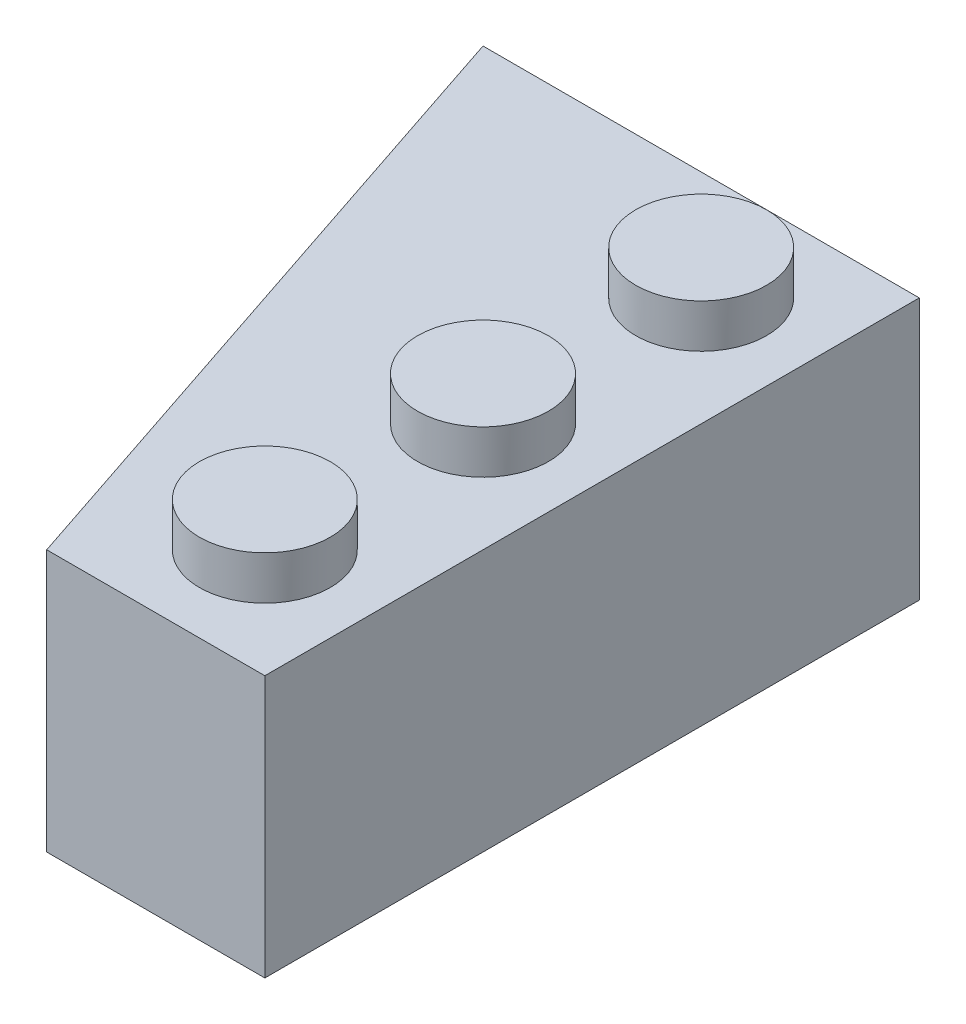
ISO-10303-21;
HEADER;
FILE_DESCRIPTION(('STEP AP214'),'2;1');
FILE_NAME('part.step','',(''),(''),'','','');
FILE_SCHEMA(('AUTOMOTIVE_DESIGN { 1 0 10303 214 1 1 1 1 }'));
ENDSEC;
DATA;
#1=APPLICATION_CONTEXT('core data for automotive mechanical design processes');
#2=APPLICATION_PROTOCOL_DEFINITION('international standard','automotive_design',2000,#1);
#3=PRODUCT_CONTEXT('',#1,'mechanical');
#4=PRODUCT('Part','Part','',(#3));
#5=PRODUCT_RELATED_PRODUCT_CATEGORY('part','',(#4));
#6=PRODUCT_DEFINITION_FORMATION('','',#4);
#7=PRODUCT_DEFINITION_CONTEXT('part definition',#1,'design');
#8=PRODUCT_DEFINITION('design','',#6,#7);
#9=PRODUCT_DEFINITION_SHAPE('','',#8);
#10=(LENGTH_UNIT() NAMED_UNIT(*) SI_UNIT(.MILLI.,.METRE.));
#11=(NAMED_UNIT(*) PLANE_ANGLE_UNIT() SI_UNIT($,.RADIAN.));
#12=(NAMED_UNIT(*) SI_UNIT($,.STERADIAN.) SOLID_ANGLE_UNIT());
#13=UNCERTAINTY_MEASURE_WITH_UNIT(LENGTH_MEASURE(1.E-05),#10,'distance_accuracy_value','');
#14=(GEOMETRIC_REPRESENTATION_CONTEXT(3) GLOBAL_UNCERTAINTY_ASSIGNED_CONTEXT((#13)) GLOBAL_UNIT_ASSIGNED_CONTEXT((#10,
#11,#12)) REPRESENTATION_CONTEXT('',''));
#15=CARTESIAN_POINT('',(0.,0.,0.));
#16=DIRECTION('',(0.,0.,1.));
#17=DIRECTION('',(1.,0.,0.));
#18=AXIS2_PLACEMENT_3D('',#15,#16,#17);
#19=CARTESIAN_POINT('',(0.,0.,0.));
#20=DIRECTION('',(0.,-1.,0.));
#21=DIRECTION('',(0.,0.,-1.));
#22=AXIS2_PLACEMENT_3D('',#19,#20,#21);
#23=PLANE('',#22);
#24=CARTESIAN_POINT('',(-12.,0.,-12.));
#25=DIRECTION('',(0.,-1.,0.));
#26=DIRECTION('',(0.,0.,-1.));
#27=AXIS2_PLACEMENT_3D('',#24,#25,#26);
#28=CIRCLE('',#27,2.4);
#29=CARTESIAN_POINT('',(-9.91642129816994,0.,-10.8089081507792));
#30=VERTEX_POINT('',#29);
#31=CARTESIAN_POINT('',(-11.2410533615596,0.,-9.72316008467877));
#32=VERTEX_POINT('',#31);
#33=EDGE_CURVE('E242',#30,#32,#28,.T.);
#34=ORIENTED_EDGE('',*,*,#33,.F.);
#35=DIRECTION('',(0.316227766016838,0.,0.948683298050514));
#36=VECTOR('',#35,1.);
#37=CARTESIAN_POINT('',(-5.68210672311918,0.,1.89403557437306));
#38=LINE('',#37,#36);
#39=CARTESIAN_POINT('',(-6.8467852479102,0.,-1.6));
#40=VERTEX_POINT('',#39);
#41=EDGE_CURVE('E161',#30,#40,#38,.T.);
#42=ORIENTED_EDGE('',*,*,#41,.T.);
#43=DIRECTION('',(1.,0.,0.));
#44=VECTOR('',#43,1.);
#45=CARTESIAN_POINT('',(0.,0.,-1.6));
#46=LINE('',#45,#44);
#47=CARTESIAN_POINT('',(-1.6,0.,-1.6));
#48=VERTEX_POINT('',#47);
#49=EDGE_CURVE('E163',#40,#48,#46,.T.);
#50=ORIENTED_EDGE('',*,*,#49,.T.);
#51=DIRECTION('',(0.,0.,-1.));
#52=VECTOR('',#51,1.);
#53=CARTESIAN_POINT('',(-1.6,0.,0.));
#54=LINE('',#53,#52);
#55=CARTESIAN_POINT('',(-1.6,0.,-22.4));
#56=VERTEX_POINT('',#55);
#57=EDGE_CURVE('E169',#48,#56,#54,.T.);
#58=ORIENTED_EDGE('',*,*,#57,.T.);
#59=DIRECTION('',(-1.,0.,0.));
#60=VECTOR('',#59,1.);
#61=CARTESIAN_POINT('',(0.,0.,-22.4));
#62=LINE('',#61,#60);
#63=CARTESIAN_POINT('',(-13.7801185812435,0.,-22.4));
#64=VERTEX_POINT('',#63);
#65=EDGE_CURVE('E164',#56,#64,#62,.T.);
#66=ORIENTED_EDGE('',*,*,#65,.T.);
#67=CARTESIAN_POINT('',(-13.5817802762874,0.,-21.8049850851317));
#68=VERTEX_POINT('',#67);
#69=EDGE_CURVE('E155',#64,#68,#38,.T.);
#70=ORIENTED_EDGE('',*,*,#69,.T.);
#71=CARTESIAN_POINT('',(-12.,0.,-20.));
#72=DIRECTION('',(0.,-1.,0.));
#73=DIRECTION('',(0.,0.,-1.));
#74=AXIS2_PLACEMENT_3D('',#71,#72,#73);
#75=CIRCLE('',#74,2.4);
#76=CARTESIAN_POINT('',(-12.1824331699509,0.,-17.6069437661221));
#77=VERTEX_POINT('',#76);
#78=EDGE_CURVE('E140',#77,#68,#75,.T.);
#79=ORIENTED_EDGE('',*,*,#78,.F.);
#80=CARTESIAN_POINT('',(-11.0477921480684,0.,-14.2030207004747));
#81=VERTEX_POINT('',#80);
#82=EDGE_CURVE('E153',#77,#81,#38,.T.);
#83=ORIENTED_EDGE('',*,*,#82,.T.);
#84=CARTESIAN_POINT('',(-12.7589466384404,0.,-14.2768399153212));
#85=VERTEX_POINT('',#84);
#86=EDGE_CURVE('E227',#85,#81,#28,.T.);
#87=ORIENTED_EDGE('',*,*,#86,.F.);
#88=DIRECTION('',(0.316227766016838,0.,0.948683298050514));
#89=VECTOR('',#88,1.);
#90=CARTESIAN_POINT('',(-8.,0.,0.));
#91=LINE('',#90,#89);
#92=CARTESIAN_POINT('',(-16.,0.,-24.));
#93=VERTEX_POINT('',#92);
#94=EDGE_CURVE('E194',#93,#85,#91,.T.);
#95=ORIENTED_EDGE('',*,*,#94,.F.);
#96=DIRECTION('',(-1.,0.,0.));
#97=VECTOR('',#96,1.);
#98=CARTESIAN_POINT('',(-16.,0.,-24.));
#99=LINE('',#98,#97);
#100=CARTESIAN_POINT('',(0.,0.,-24.));
#101=VERTEX_POINT('',#100);
#102=EDGE_CURVE('E191',#101,#93,#99,.T.);
#103=ORIENTED_EDGE('',*,*,#102,.F.);
#104=DIRECTION('',(0.,0.,-1.));
#105=VECTOR('',#104,1.);
#106=CARTESIAN_POINT('',(0.,0.,-24.));
#107=LINE('',#106,#105);
#108=CARTESIAN_POINT('',(0.,0.,0.));
#109=VERTEX_POINT('',#108);
#110=EDGE_CURVE('E177',#109,#101,#107,.T.);
#111=ORIENTED_EDGE('',*,*,#110,.F.);
#112=DIRECTION('',(1.,0.,0.));
#113=VECTOR('',#112,1.);
#114=CARTESIAN_POINT('',(0.,0.,0.));
#115=LINE('',#114,#113);
#116=CARTESIAN_POINT('',(-8.,0.,0.));
#117=VERTEX_POINT('',#116);
#118=EDGE_CURVE('E182',#117,#109,#115,.T.);
#119=ORIENTED_EDGE('',*,*,#118,.F.);
#120=EDGE_CURVE('E193',#32,#117,#91,.T.);
#121=ORIENTED_EDGE('',*,*,#120,.F.);
#122=EDGE_LOOP('',(#34,#42,#50,#58,#66,#70,#79,#83,#87,#95,#103,#111,#119,#121));
#123=FACE_BOUND('',#122,.T.);
#124=ADVANCED_FACE('F38',(#123),#23,.T.);
#125=CARTESIAN_POINT('',(-4.,11.2,-20.));
#126=DIRECTION('',(0.,1.,0.));
#127=DIRECTION('',(0.,0.,1.));
#128=AXIS2_PLACEMENT_3D('',#125,#126,#127);
#129=PLANE('',#128);
#130=CARTESIAN_POINT('',(-4.,11.2,-20.));
#131=DIRECTION('',(0.,1.,0.));
#132=DIRECTION('',(0.,0.,1.));
#133=AXIS2_PLACEMENT_3D('',#130,#131,#132);
#134=CIRCLE('',#133,2.4);
#135=CARTESIAN_POINT('',(-4.,11.2,-17.6));
#136=VERTEX_POINT('',#135);
#137=EDGE_CURVE('E218',#136,#136,#134,.T.);
#138=ORIENTED_EDGE('',*,*,#137,.T.);
#139=EDGE_LOOP('',(#138));
#140=FACE_BOUND('',#139,.T.);
#141=ADVANCED_FACE('F40',(#140),#129,.T.);
#142=CARTESIAN_POINT('',(-4.,11.2,-20.));
#143=DIRECTION('',(0.,-1.,0.));
#144=DIRECTION('',(0.,0.,-1.));
#145=AXIS2_PLACEMENT_3D('',#142,#143,#144);
#146=CYLINDRICAL_SURFACE('',#145,2.4);
#147=ORIENTED_EDGE('',*,*,#137,.F.);
#148=EDGE_LOOP('',(#147));
#149=FACE_BOUND('',#148,.T.);
#150=CARTESIAN_POINT('',(-4.,9.6,-20.));
#151=DIRECTION('',(0.,-1.,0.));
#152=DIRECTION('',(0.,0.,-1.));
#153=AXIS2_PLACEMENT_3D('',#150,#151,#152);
#154=CIRCLE('',#153,2.4);
#155=CARTESIAN_POINT('',(-4.,9.6,-22.4));
#156=VERTEX_POINT('',#155);
#157=EDGE_CURVE('E215',#156,#156,#154,.F.);
#158=ORIENTED_EDGE('',*,*,#157,.T.);
#159=EDGE_LOOP('',(#158));
#160=FACE_BOUND('',#159,.T.);
#161=ADVANCED_FACE('F332',(#149,#160),#146,.T.);
#162=CARTESIAN_POINT('',(0.,9.6,-24.));
#163=DIRECTION('',(-1.,0.,0.));
#164=DIRECTION('',(0.,0.,1.));
#165=AXIS2_PLACEMENT_3D('',#162,#163,#164);
#166=PLANE('',#165);
#167=ORIENTED_EDGE('',*,*,#110,.T.);
#168=DIRECTION('',(0.,-1.,0.));
#169=VECTOR('',#168,1.);
#170=CARTESIAN_POINT('',(0.,9.6,-24.));
#171=LINE('',#170,#169);
#172=CARTESIAN_POINT('',(0.,9.6,-24.));
#173=VERTEX_POINT('',#172);
#174=EDGE_CURVE('E206',#173,#101,#171,.T.);
#175=ORIENTED_EDGE('',*,*,#174,.F.);
#176=DIRECTION('',(0.,0.,-1.));
#177=VECTOR('',#176,1.);
#178=CARTESIAN_POINT('',(0.,9.6,-24.));
#179=LINE('',#178,#177);
#180=CARTESIAN_POINT('',(0.,9.6,0.));
#181=VERTEX_POINT('',#180);
#182=EDGE_CURVE('E178',#181,#173,#179,.T.);
#183=ORIENTED_EDGE('',*,*,#182,.F.);
#184=DIRECTION('',(0.,-1.,0.));
#185=VECTOR('',#184,1.);
#186=CARTESIAN_POINT('',(0.,9.6,0.));
#187=LINE('',#186,#185);
#188=EDGE_CURVE('E188',#181,#109,#187,.T.);
#189=ORIENTED_EDGE('',*,*,#188,.T.);
#190=EDGE_LOOP('',(#167,#175,#183,#189));
#191=FACE_BOUND('',#190,.T.);
#192=ADVANCED_FACE('F317',(#191),#166,.F.);
#193=CARTESIAN_POINT('',(-16.,9.6,-24.));
#194=DIRECTION('',(0.,0.,1.));
#195=DIRECTION('',(1.,0.,0.));
#196=AXIS2_PLACEMENT_3D('',#193,#194,#195);
#197=PLANE('',#196);
#198=ORIENTED_EDGE('',*,*,#102,.T.);
#199=DIRECTION('',(0.,-1.,0.));
#200=VECTOR('',#199,1.);
#201=CARTESIAN_POINT('',(-16.,9.6,-24.));
#202=LINE('',#201,#200);
#203=CARTESIAN_POINT('',(-16.,9.6,-24.));
#204=VERTEX_POINT('',#203);
#205=EDGE_CURVE('E203',#204,#93,#202,.T.);
#206=ORIENTED_EDGE('',*,*,#205,.F.);
#207=DIRECTION('',(-1.,0.,0.));
#208=VECTOR('',#207,1.);
#209=CARTESIAN_POINT('',(-16.,9.6,-24.));
#210=LINE('',#209,#208);
#211=EDGE_CURVE('E181',#173,#204,#210,.T.);
#212=ORIENTED_EDGE('',*,*,#211,.F.);
#213=ORIENTED_EDGE('',*,*,#174,.T.);
#214=EDGE_LOOP('',(#198,#206,#212,#213));
#215=FACE_BOUND('',#214,.T.);
#216=ADVANCED_FACE('F314',(#215),#197,.F.);
#217=CARTESIAN_POINT('',(-8.,9.6,0.));
#218=DIRECTION('',(0.948683298050514,0.,-0.316227766016838));
#219=DIRECTION('',(-0.316227766016838,0.,-0.948683298050514));
#220=AXIS2_PLACEMENT_3D('',#217,#218,#219);
#221=PLANE('',#220);
#222=DIRECTION('',(-0.316227766016838,0.,-0.948683298050514));
#223=VECTOR('',#222,1.);
#224=CARTESIAN_POINT('',(-8.,1.6,0.));
#225=LINE('',#224,#223);
#226=CARTESIAN_POINT('',(-11.2410533615596,1.6,-9.72316008467877));
#227=VERTEX_POINT('',#226);
#228=CARTESIAN_POINT('',(-12.7589466384404,1.6,-14.2768399153212));
#229=VERTEX_POINT('',#228);
#230=EDGE_CURVE('E238',#227,#229,#225,.T.);
#231=ORIENTED_EDGE('',*,*,#230,.F.);
#232=DIRECTION('',(0.,-1.,0.));
#233=VECTOR('',#232,1.);
#234=CARTESIAN_POINT('',(-11.2410533615596,1.6,-9.72316008467877));
#235=LINE('',#234,#233);
#236=EDGE_CURVE('E237',#227,#32,#235,.T.);
#237=ORIENTED_EDGE('',*,*,#236,.T.);
#238=ORIENTED_EDGE('',*,*,#120,.T.);
#239=DIRECTION('',(0.,-1.,0.));
#240=VECTOR('',#239,1.);
#241=CARTESIAN_POINT('',(-8.,9.6,0.));
#242=LINE('',#241,#240);
#243=CARTESIAN_POINT('',(-8.,9.6,0.));
#244=VERTEX_POINT('',#243);
#245=EDGE_CURVE('E200',#244,#117,#242,.T.);
#246=ORIENTED_EDGE('',*,*,#245,.F.);
#247=DIRECTION('',(0.316227766016838,0.,0.948683298050514));
#248=VECTOR('',#247,1.);
#249=CARTESIAN_POINT('',(-8.,9.6,0.));
#250=LINE('',#249,#248);
#251=EDGE_CURVE('E184',#204,#244,#250,.T.);
#252=ORIENTED_EDGE('',*,*,#251,.F.);
#253=ORIENTED_EDGE('',*,*,#205,.T.);
#254=ORIENTED_EDGE('',*,*,#94,.T.);
#255=DIRECTION('',(0.,-1.,0.));
#256=VECTOR('',#255,1.);
#257=CARTESIAN_POINT('',(-12.7589466384404,1.6,-14.2768399153212));
#258=LINE('',#257,#256);
#259=EDGE_CURVE('E240',#85,#229,#258,.F.);
#260=ORIENTED_EDGE('',*,*,#259,.T.);
#261=EDGE_LOOP('',(#231,#237,#238,#246,#252,#253,#254,#260));
#262=FACE_BOUND('',#261,.T.);
#263=ADVANCED_FACE('F307',(#262),#221,.F.);
#264=CARTESIAN_POINT('',(0.,9.6,0.));
#265=DIRECTION('',(0.,0.,-1.));
#266=DIRECTION('',(-1.,0.,0.));
#267=AXIS2_PLACEMENT_3D('',#264,#265,#266);
#268=PLANE('',#267);
#269=ORIENTED_EDGE('',*,*,#118,.T.);
#270=ORIENTED_EDGE('',*,*,#188,.F.);
#271=DIRECTION('',(1.,0.,0.));
#272=VECTOR('',#271,1.);
#273=CARTESIAN_POINT('',(0.,9.6,0.));
#274=LINE('',#273,#272);
#275=EDGE_CURVE('E186',#244,#181,#274,.T.);
#276=ORIENTED_EDGE('',*,*,#275,.F.);
#277=ORIENTED_EDGE('',*,*,#245,.T.);
#278=EDGE_LOOP('',(#269,#270,#276,#277));
#279=FACE_BOUND('',#278,.T.);
#280=ADVANCED_FACE('F321',(#279),#268,.F.);
#281=CARTESIAN_POINT('',(0.,9.6,0.));
#282=DIRECTION('',(0.,-1.,0.));
#283=DIRECTION('',(0.,0.,-1.));
#284=AXIS2_PLACEMENT_3D('',#281,#282,#283);
#285=PLANE('',#284);
#286=CARTESIAN_POINT('',(-4.,9.6,-12.));
#287=DIRECTION('',(0.,-1.,0.));
#288=DIRECTION('',(0.,0.,-1.));
#289=AXIS2_PLACEMENT_3D('',#286,#287,#288);
#290=CIRCLE('',#289,2.4);
#291=CARTESIAN_POINT('',(-4.,9.6,-14.4));
#292=VERTEX_POINT('',#291);
#293=EDGE_CURVE('E212',#292,#292,#290,.F.);
#294=ORIENTED_EDGE('',*,*,#293,.F.);
#295=EDGE_LOOP('',(#294));
#296=FACE_BOUND('',#295,.T.);
#297=CARTESIAN_POINT('',(-4.,9.6,-4.));
#298=DIRECTION('',(0.,-1.,0.));
#299=DIRECTION('',(0.,0.,-1.));
#300=AXIS2_PLACEMENT_3D('',#297,#298,#299);
#301=CIRCLE('',#300,2.4);
#302=CARTESIAN_POINT('',(-4.,9.6,-6.4));
#303=VERTEX_POINT('',#302);
#304=EDGE_CURVE('E209',#303,#303,#301,.F.);
#305=ORIENTED_EDGE('',*,*,#304,.F.);
#306=EDGE_LOOP('',(#305));
#307=FACE_BOUND('',#306,.T.);
#308=ORIENTED_EDGE('',*,*,#182,.T.);
#309=ORIENTED_EDGE('',*,*,#211,.T.);
#310=ORIENTED_EDGE('',*,*,#251,.T.);
#311=ORIENTED_EDGE('',*,*,#275,.T.);
#312=EDGE_LOOP('',(#308,#309,#310,#311));
#313=FACE_BOUND('',#312,.T.);
#314=ORIENTED_EDGE('',*,*,#157,.F.);
#315=EDGE_LOOP('',(#314));
#316=FACE_BOUND('',#315,.T.);
#317=ADVANCED_FACE('F324',(#296,#307,#313,#316),#285,.F.);
#318=CARTESIAN_POINT('',(-4.,11.2,-4.));
#319=DIRECTION('',(0.,-1.,0.));
#320=DIRECTION('',(0.,0.,-1.));
#321=AXIS2_PLACEMENT_3D('',#318,#319,#320);
#322=CYLINDRICAL_SURFACE('',#321,2.4);
#323=CARTESIAN_POINT('',(-4.,11.2,-4.));
#324=DIRECTION('',(0.,1.,0.));
#325=DIRECTION('',(0.,0.,1.));
#326=AXIS2_PLACEMENT_3D('',#323,#324,#325);
#327=CIRCLE('',#326,2.4);
#328=CARTESIAN_POINT('',(-4.,11.2,-1.6));
#329=VERTEX_POINT('',#328);
#330=EDGE_CURVE('E173',#329,#329,#327,.T.);
#331=ORIENTED_EDGE('',*,*,#330,.F.);
#332=EDGE_LOOP('',(#331));
#333=FACE_BOUND('',#332,.T.);
#334=ORIENTED_EDGE('',*,*,#304,.T.);
#335=EDGE_LOOP('',(#334));
#336=FACE_BOUND('',#335,.T.);
#337=ADVANCED_FACE('F327',(#333,#336),#322,.T.);
#338=CARTESIAN_POINT('',(-4.,11.2,-4.));
#339=DIRECTION('',(0.,1.,0.));
#340=DIRECTION('',(0.,0.,1.));
#341=AXIS2_PLACEMENT_3D('',#338,#339,#340);
#342=PLANE('',#341);
#343=ORIENTED_EDGE('',*,*,#330,.T.);
#344=EDGE_LOOP('',(#343));
#345=FACE_BOUND('',#344,.T.);
#346=ADVANCED_FACE('F380',(#345),#342,.T.);
#347=CARTESIAN_POINT('',(-4.,11.2,-12.));
#348=DIRECTION('',(0.,-1.,0.));
#349=DIRECTION('',(0.,0.,-1.));
#350=AXIS2_PLACEMENT_3D('',#347,#348,#349);
#351=CYLINDRICAL_SURFACE('',#350,2.4);
#352=CARTESIAN_POINT('',(-4.,11.2,-12.));
#353=DIRECTION('',(0.,1.,0.));
#354=DIRECTION('',(0.,0.,1.));
#355=AXIS2_PLACEMENT_3D('',#352,#353,#354);
#356=CIRCLE('',#355,2.4);
#357=CARTESIAN_POINT('',(-4.,11.2,-9.6));
#358=VERTEX_POINT('',#357);
#359=EDGE_CURVE('E170',#358,#358,#356,.T.);
#360=ORIENTED_EDGE('',*,*,#359,.F.);
#361=EDGE_LOOP('',(#360));
#362=FACE_BOUND('',#361,.T.);
#363=ORIENTED_EDGE('',*,*,#293,.T.);
#364=EDGE_LOOP('',(#363));
#365=FACE_BOUND('',#364,.T.);
#366=ADVANCED_FACE('F387',(#362,#365),#351,.T.);
#367=CARTESIAN_POINT('',(-4.,11.2,-12.));
#368=DIRECTION('',(0.,1.,0.));
#369=DIRECTION('',(0.,0.,1.));
#370=AXIS2_PLACEMENT_3D('',#367,#368,#369);
#371=PLANE('',#370);
#372=ORIENTED_EDGE('',*,*,#359,.T.);
#373=EDGE_LOOP('',(#372));
#374=FACE_BOUND('',#373,.T.);
#375=ADVANCED_FACE('F395',(#374),#371,.T.);
#376=CARTESIAN_POINT('',(-4.,9.6,-20.));
#377=DIRECTION('',(0.,1.,0.));
#378=DIRECTION('',(0.,0.,1.));
#379=AXIS2_PLACEMENT_3D('',#376,#377,#378);
#380=PLANE('',#379);
#381=CARTESIAN_POINT('',(-4.,9.6,-20.));
#382=DIRECTION('',(0.,1.,0.));
#383=DIRECTION('',(0.,0.,1.));
#384=AXIS2_PLACEMENT_3D('',#381,#382,#383);
#385=CIRCLE('',#384,0.8);
#386=CARTESIAN_POINT('',(-4.,9.6,-19.2));
#387=VERTEX_POINT('',#386);
#388=EDGE_CURVE('E174',#387,#387,#385,.T.);
#389=ORIENTED_EDGE('',*,*,#388,.F.);
#390=EDGE_LOOP('',(#389));
#391=FACE_BOUND('',#390,.T.);
#392=ADVANCED_FACE('F403',(#391),#380,.F.);
#393=CARTESIAN_POINT('',(-4.,11.2,-20.));
#394=DIRECTION('',(0.,-1.,0.));
#395=DIRECTION('',(0.,0.,-1.));
#396=AXIS2_PLACEMENT_3D('',#393,#394,#395);
#397=CYLINDRICAL_SURFACE('',#396,0.8);
#398=ORIENTED_EDGE('',*,*,#388,.T.);
#399=EDGE_LOOP('',(#398));
#400=FACE_BOUND('',#399,.T.);
#401=CARTESIAN_POINT('',(-4.,8.,-20.));
#402=DIRECTION('',(0.,-1.,0.));
#403=DIRECTION('',(0.,0.,-1.));
#404=AXIS2_PLACEMENT_3D('',#401,#402,#403);
#405=CIRCLE('',#404,0.8);
#406=CARTESIAN_POINT('',(-4.,8.,-20.8));
#407=VERTEX_POINT('',#406);
#408=EDGE_CURVE('E251',#407,#407,#405,.F.);
#409=ORIENTED_EDGE('',*,*,#408,.F.);
#410=EDGE_LOOP('',(#409));
#411=FACE_BOUND('',#410,.T.);
#412=ADVANCED_FACE('F416',(#400,#411),#397,.F.);
#413=CARTESIAN_POINT('',(-1.6,9.6,-24.));
#414=DIRECTION('',(-1.,0.,0.));
#415=DIRECTION('',(0.,0.,1.));
#416=AXIS2_PLACEMENT_3D('',#413,#414,#415);
#417=PLANE('',#416);
#418=ORIENTED_EDGE('',*,*,#57,.F.);
#419=DIRECTION('',(0.,-1.,0.));
#420=VECTOR('',#419,1.);
#421=CARTESIAN_POINT('',(-1.6,9.6,-1.6));
#422=LINE('',#421,#420);
#423=CARTESIAN_POINT('',(-1.6,8.,-1.6));
#424=VERTEX_POINT('',#423);
#425=EDGE_CURVE('E270',#424,#48,#422,.T.);
#426=ORIENTED_EDGE('',*,*,#425,.F.);
#427=DIRECTION('',(0.,0.,-1.));
#428=VECTOR('',#427,1.);
#429=CARTESIAN_POINT('',(-1.6,8.,0.));
#430=LINE('',#429,#428);
#431=CARTESIAN_POINT('',(-1.6,8.,-22.4));
#432=VERTEX_POINT('',#431);
#433=EDGE_CURVE('E261',#424,#432,#430,.T.);
#434=ORIENTED_EDGE('',*,*,#433,.T.);
#435=DIRECTION('',(0.,-1.,0.));
#436=VECTOR('',#435,1.);
#437=CARTESIAN_POINT('',(-1.6,9.6,-22.4));
#438=LINE('',#437,#436);
#439=EDGE_CURVE('E260',#432,#56,#438,.T.);
#440=ORIENTED_EDGE('',*,*,#439,.T.);
#441=EDGE_LOOP('',(#418,#426,#434,#440));
#442=FACE_BOUND('',#441,.T.);
#443=ADVANCED_FACE('F290',(#442),#417,.T.);
#444=CARTESIAN_POINT('',(-16.,9.6,-22.4));
#445=DIRECTION('',(0.,0.,1.));
#446=DIRECTION('',(1.,0.,0.));
#447=AXIS2_PLACEMENT_3D('',#444,#445,#446);
#448=PLANE('',#447);
#449=DIRECTION('',(0.,-1.,0.));
#450=VECTOR('',#449,1.);
#451=CARTESIAN_POINT('',(-13.7801185812435,9.6,-22.4));
#452=LINE('',#451,#450);
#453=CARTESIAN_POINT('',(-13.7801185812435,8.,-22.4));
#454=VERTEX_POINT('',#453);
#455=EDGE_CURVE('E273',#454,#64,#452,.T.);
#456=ORIENTED_EDGE('',*,*,#455,.T.);
#457=ORIENTED_EDGE('',*,*,#65,.F.);
#458=ORIENTED_EDGE('',*,*,#439,.F.);
#459=DIRECTION('',(-1.,0.,0.));
#460=VECTOR('',#459,1.);
#461=CARTESIAN_POINT('',(0.,8.,-22.4));
#462=LINE('',#461,#460);
#463=EDGE_CURVE('E264',#432,#454,#462,.T.);
#464=ORIENTED_EDGE('',*,*,#463,.T.);
#465=EDGE_LOOP('',(#456,#457,#458,#464));
#466=FACE_BOUND('',#465,.T.);
#467=ADVANCED_FACE('F294',(#466),#448,.T.);
#468=CARTESIAN_POINT('',(-6.48210672311918,9.6,-0.505964425626941));
#469=DIRECTION('',(0.948683298050514,0.,-0.316227766016838));
#470=DIRECTION('',(-0.316227766016838,0.,-0.948683298050514));
#471=AXIS2_PLACEMENT_3D('',#468,#469,#470);
#472=PLANE('',#471);
#473=DIRECTION('',(0.,-1.,0.));
#474=VECTOR('',#473,1.);
#475=CARTESIAN_POINT('',(-9.91642129816994,1.6,-10.8089081507792));
#476=LINE('',#475,#474);
#477=CARTESIAN_POINT('',(-9.91642129816994,1.6,-10.8089081507792));
#478=VERTEX_POINT('',#477);
#479=EDGE_CURVE('E11',#478,#30,#476,.T.);
#480=ORIENTED_EDGE('',*,*,#479,.F.);
#481=DIRECTION('',(-0.316227766016838,0.,-0.948683298050514));
#482=VECTOR('',#481,1.);
#483=CARTESIAN_POINT('',(-6.48210672311918,1.6,-0.505964425626941));
#484=LINE('',#483,#482);
#485=CARTESIAN_POINT('',(-11.0477921480684,1.6,-14.2030207004747));
#486=VERTEX_POINT('',#485);
#487=EDGE_CURVE('E145',#478,#486,#484,.T.);
#488=ORIENTED_EDGE('',*,*,#487,.T.);
#489=DIRECTION('',(0.,-1.,0.));
#490=VECTOR('',#489,1.);
#491=CARTESIAN_POINT('',(-11.0477921480684,1.6,-14.2030207004747));
#492=LINE('',#491,#490);
#493=EDGE_CURVE('E46',#81,#486,#492,.F.);
#494=ORIENTED_EDGE('',*,*,#493,.F.);
#495=ORIENTED_EDGE('',*,*,#82,.F.);
#496=DIRECTION('',(0.,-1.,0.));
#497=VECTOR('',#496,1.);
#498=CARTESIAN_POINT('',(-12.1824331699509,1.6,-17.6069437661221));
#499=LINE('',#498,#497);
#500=CARTESIAN_POINT('',(-12.1824331699509,1.6,-17.6069437661221));
#501=VERTEX_POINT('',#500);
#502=EDGE_CURVE('E137',#501,#77,#499,.T.);
#503=ORIENTED_EDGE('',*,*,#502,.F.);
#504=DIRECTION('',(-0.316227766016838,0.,-0.948683298050514));
#505=VECTOR('',#504,1.);
#506=CARTESIAN_POINT('',(-6.48210672311918,1.6,-0.505964425626941));
#507=LINE('',#506,#505);
#508=CARTESIAN_POINT('',(-13.5817802762874,1.6,-21.8049850851317));
#509=VERTEX_POINT('',#508);
#510=EDGE_CURVE('E221',#501,#509,#507,.T.);
#511=ORIENTED_EDGE('',*,*,#510,.T.);
#512=DIRECTION('',(0.,-1.,0.));
#513=VECTOR('',#512,1.);
#514=CARTESIAN_POINT('',(-13.5817802762874,1.6,-21.8049850851317));
#515=LINE('',#514,#513);
#516=EDGE_CURVE('E146',#68,#509,#515,.F.);
#517=ORIENTED_EDGE('',*,*,#516,.F.);
#518=ORIENTED_EDGE('',*,*,#69,.F.);
#519=ORIENTED_EDGE('',*,*,#455,.F.);
#520=DIRECTION('',(0.316227766016838,0.,0.948683298050514));
#521=VECTOR('',#520,1.);
#522=CARTESIAN_POINT('',(-5.68210672311918,8.,1.89403557437306));
#523=LINE('',#522,#521);
#524=CARTESIAN_POINT('',(-6.8467852479102,8.,-1.6));
#525=VERTEX_POINT('',#524);
#526=EDGE_CURVE('E266',#454,#525,#523,.T.);
#527=ORIENTED_EDGE('',*,*,#526,.T.);
#528=DIRECTION('',(0.,-1.,0.));
#529=VECTOR('',#528,1.);
#530=CARTESIAN_POINT('',(-6.8467852479102,9.6,-1.6));
#531=LINE('',#530,#529);
#532=EDGE_CURVE('E275',#525,#40,#531,.T.);
#533=ORIENTED_EDGE('',*,*,#532,.T.);
#534=ORIENTED_EDGE('',*,*,#41,.F.);
#535=EDGE_LOOP('',(#480,#488,#494,#495,#503,#511,#517,#518,#519,#527,#533,#534));
#536=FACE_BOUND('',#535,.T.);
#537=ADVANCED_FACE('F159',(#536),#472,.T.);
#538=CARTESIAN_POINT('',(0.,9.6,-1.6));
#539=DIRECTION('',(0.,0.,-1.));
#540=DIRECTION('',(-1.,0.,0.));
#541=AXIS2_PLACEMENT_3D('',#538,#539,#540);
#542=PLANE('',#541);
#543=ORIENTED_EDGE('',*,*,#49,.F.);
#544=ORIENTED_EDGE('',*,*,#532,.F.);
#545=DIRECTION('',(1.,0.,0.));
#546=VECTOR('',#545,1.);
#547=CARTESIAN_POINT('',(0.,8.,-1.6));
#548=LINE('',#547,#546);
#549=EDGE_CURVE('E268',#525,#424,#548,.T.);
#550=ORIENTED_EDGE('',*,*,#549,.T.);
#551=ORIENTED_EDGE('',*,*,#425,.T.);
#552=EDGE_LOOP('',(#543,#544,#550,#551));
#553=FACE_BOUND('',#552,.T.);
#554=ADVANCED_FACE('F303',(#553),#542,.T.);
#555=CARTESIAN_POINT('',(0.,8.,0.));
#556=DIRECTION('',(0.,-1.,0.));
#557=DIRECTION('',(0.,0.,-1.));
#558=AXIS2_PLACEMENT_3D('',#555,#556,#557);
#559=PLANE('',#558);
#560=CARTESIAN_POINT('',(-4.,8.,-12.));
#561=DIRECTION('',(0.,-1.,0.));
#562=DIRECTION('',(0.,0.,-1.));
#563=AXIS2_PLACEMENT_3D('',#560,#561,#562);
#564=CIRCLE('',#563,0.8);
#565=CARTESIAN_POINT('',(-4.,8.,-12.8));
#566=VERTEX_POINT('',#565);
#567=EDGE_CURVE('E254',#566,#566,#564,.F.);
#568=ORIENTED_EDGE('',*,*,#567,.T.);
#569=EDGE_LOOP('',(#568));
#570=FACE_BOUND('',#569,.T.);
#571=CARTESIAN_POINT('',(-4.,8.,-4.));
#572=DIRECTION('',(0.,-1.,0.));
#573=DIRECTION('',(0.,0.,-1.));
#574=AXIS2_PLACEMENT_3D('',#571,#572,#573);
#575=CIRCLE('',#574,0.8);
#576=CARTESIAN_POINT('',(-4.,8.,-4.8));
#577=VERTEX_POINT('',#576);
#578=EDGE_CURVE('E257',#577,#577,#575,.F.);
#579=ORIENTED_EDGE('',*,*,#578,.T.);
#580=EDGE_LOOP('',(#579));
#581=FACE_BOUND('',#580,.T.);
#582=ORIENTED_EDGE('',*,*,#433,.F.);
#583=ORIENTED_EDGE('',*,*,#549,.F.);
#584=ORIENTED_EDGE('',*,*,#526,.F.);
#585=ORIENTED_EDGE('',*,*,#463,.F.);
#586=EDGE_LOOP('',(#582,#583,#584,#585));
#587=FACE_BOUND('',#586,.T.);
#588=ORIENTED_EDGE('',*,*,#408,.T.);
#589=EDGE_LOOP('',(#588));
#590=FACE_BOUND('',#589,.T.);
#591=ADVANCED_FACE('F300',(#570,#581,#587,#590),#559,.T.);
#592=CARTESIAN_POINT('',(-4.,11.2,-4.));
#593=DIRECTION('',(0.,-1.,0.));
#594=DIRECTION('',(0.,0.,-1.));
#595=AXIS2_PLACEMENT_3D('',#592,#593,#594);
#596=CYLINDRICAL_SURFACE('',#595,0.8);
#597=CARTESIAN_POINT('',(-4.,9.6,-4.));
#598=DIRECTION('',(0.,1.,0.));
#599=DIRECTION('',(0.,0.,1.));
#600=AXIS2_PLACEMENT_3D('',#597,#598,#599);
#601=CIRCLE('',#600,0.8);
#602=CARTESIAN_POINT('',(-4.,9.6,-3.2));
#603=VERTEX_POINT('',#602);
#604=EDGE_CURVE('E280',#603,#603,#601,.T.);
#605=ORIENTED_EDGE('',*,*,#604,.T.);
#606=EDGE_LOOP('',(#605));
#607=FACE_BOUND('',#606,.T.);
#608=ORIENTED_EDGE('',*,*,#578,.F.);
#609=EDGE_LOOP('',(#608));
#610=FACE_BOUND('',#609,.T.);
#611=ADVANCED_FACE('F460',(#607,#610),#596,.F.);
#612=CARTESIAN_POINT('',(-4.,9.6,-4.));
#613=DIRECTION('',(0.,1.,0.));
#614=DIRECTION('',(0.,0.,1.));
#615=AXIS2_PLACEMENT_3D('',#612,#613,#614);
#616=PLANE('',#615);
#617=ORIENTED_EDGE('',*,*,#604,.F.);
#618=EDGE_LOOP('',(#617));
#619=FACE_BOUND('',#618,.T.);
#620=ADVANCED_FACE('F469',(#619),#616,.F.);
#621=CARTESIAN_POINT('',(-4.,11.2,-12.));
#622=DIRECTION('',(0.,-1.,0.));
#623=DIRECTION('',(0.,0.,-1.));
#624=AXIS2_PLACEMENT_3D('',#621,#622,#623);
#625=CYLINDRICAL_SURFACE('',#624,0.8);
#626=CARTESIAN_POINT('',(-4.,9.6,-12.));
#627=DIRECTION('',(0.,1.,0.));
#628=DIRECTION('',(0.,0.,1.));
#629=AXIS2_PLACEMENT_3D('',#626,#627,#628);
#630=CIRCLE('',#629,0.8);
#631=CARTESIAN_POINT('',(-4.,9.6,-11.2));
#632=VERTEX_POINT('',#631);
#633=EDGE_CURVE('E248',#632,#632,#630,.T.);
#634=ORIENTED_EDGE('',*,*,#633,.T.);
#635=EDGE_LOOP('',(#634));
#636=FACE_BOUND('',#635,.T.);
#637=ORIENTED_EDGE('',*,*,#567,.F.);
#638=EDGE_LOOP('',(#637));
#639=FACE_BOUND('',#638,.T.);
#640=ADVANCED_FACE('F478',(#636,#639),#625,.F.);
#641=CARTESIAN_POINT('',(-4.,9.6,-12.));
#642=DIRECTION('',(0.,1.,0.));
#643=DIRECTION('',(0.,0.,1.));
#644=AXIS2_PLACEMENT_3D('',#641,#642,#643);
#645=PLANE('',#644);
#646=ORIENTED_EDGE('',*,*,#633,.F.);
#647=EDGE_LOOP('',(#646));
#648=FACE_BOUND('',#647,.T.);
#649=ADVANCED_FACE('F487',(#648),#645,.F.);
#650=CARTESIAN_POINT('',(-12.,1.6,-20.));
#651=DIRECTION('',(0.,-1.,0.));
#652=DIRECTION('',(0.,0.,-1.));
#653=AXIS2_PLACEMENT_3D('',#650,#651,#652);
#654=CYLINDRICAL_SURFACE('',#653,2.4);
#655=ORIENTED_EDGE('',*,*,#502,.T.);
#656=ORIENTED_EDGE('',*,*,#78,.T.);
#657=ORIENTED_EDGE('',*,*,#516,.T.);
#658=CARTESIAN_POINT('',(-12.,1.6,-20.));
#659=DIRECTION('',(0.,-1.,0.));
#660=DIRECTION('',(0.,0.,-1.));
#661=AXIS2_PLACEMENT_3D('',#658,#659,#660);
#662=CIRCLE('',#661,2.4);
#663=EDGE_CURVE('E60',#501,#509,#662,.T.);
#664=ORIENTED_EDGE('',*,*,#663,.F.);
#665=EDGE_LOOP('',(#655,#656,#657,#664));
#666=FACE_BOUND('',#665,.T.);
#667=ADVANCED_FACE('F139',(#666),#654,.F.);
#668=CARTESIAN_POINT('',(-12.,1.6,-20.));
#669=DIRECTION('',(0.,-1.,0.));
#670=DIRECTION('',(0.,0.,-1.));
#671=AXIS2_PLACEMENT_3D('',#668,#669,#670);
#672=PLANE('',#671);
#673=ORIENTED_EDGE('',*,*,#663,.T.);
#674=ORIENTED_EDGE('',*,*,#510,.F.);
#675=EDGE_LOOP('',(#673,#674));
#676=FACE_BOUND('',#675,.T.);
#677=ADVANCED_FACE('F503',(#676),#672,.T.);
#678=CARTESIAN_POINT('',(-12.,1.6,-12.));
#679=DIRECTION('',(0.,-1.,0.));
#680=DIRECTION('',(0.,0.,-1.));
#681=AXIS2_PLACEMENT_3D('',#678,#679,#680);
#682=CYLINDRICAL_SURFACE('',#681,2.4);
#683=CARTESIAN_POINT('',(-12.,1.6,-12.));
#684=DIRECTION('',(0.,-1.,0.));
#685=DIRECTION('',(0.,0.,-1.));
#686=AXIS2_PLACEMENT_3D('',#683,#684,#685);
#687=CIRCLE('',#686,2.4);
#688=EDGE_CURVE('E232',#478,#227,#687,.T.);
#689=ORIENTED_EDGE('',*,*,#688,.F.);
#690=ORIENTED_EDGE('',*,*,#479,.T.);
#691=ORIENTED_EDGE('',*,*,#33,.T.);
#692=ORIENTED_EDGE('',*,*,#236,.F.);
#693=EDGE_LOOP('',(#689,#690,#691,#692));
#694=FACE_BOUND('',#693,.T.);
#695=ADVANCED_FACE('F235',(#694),#682,.F.);
#696=ORIENTED_EDGE('',*,*,#86,.T.);
#697=ORIENTED_EDGE('',*,*,#493,.T.);
#698=EDGE_CURVE('E53',#229,#486,#687,.T.);
#699=ORIENTED_EDGE('',*,*,#698,.F.);
#700=ORIENTED_EDGE('',*,*,#259,.F.);
#701=EDGE_LOOP('',(#696,#697,#699,#700));
#702=FACE_BOUND('',#701,.T.);
#703=ADVANCED_FACE('F225',(#702),#682,.F.);
#704=CARTESIAN_POINT('',(-12.,1.6,-12.));
#705=DIRECTION('',(0.,-1.,0.));
#706=DIRECTION('',(0.,0.,-1.));
#707=AXIS2_PLACEMENT_3D('',#704,#705,#706);
#708=PLANE('',#707);
#709=ORIENTED_EDGE('',*,*,#230,.T.);
#710=ORIENTED_EDGE('',*,*,#698,.T.);
#711=ORIENTED_EDGE('',*,*,#487,.F.);
#712=ORIENTED_EDGE('',*,*,#688,.T.);
#713=EDGE_LOOP('',(#709,#710,#711,#712));
#714=FACE_BOUND('',#713,.T.);
#715=ADVANCED_FACE('F231',(#714),#708,.T.);
#716=CLOSED_SHELL('',(#124,#141,#161,#192,#216,#263,#280,#317,#337,#346,#366,#375,#392,#412,
#443,#467,#537,#554,#591,#611,#620,#640,#649,#667,#677,#695,#703,#715));
#717=MANIFOLD_SOLID_BREP('B2',#716);
#718=ADVANCED_BREP_SHAPE_REPRESENTATION('',(#18,#717),#14);
#719=SHAPE_DEFINITION_REPRESENTATION(#9,#718);
ENDSEC;
END-ISO-10303-21;
